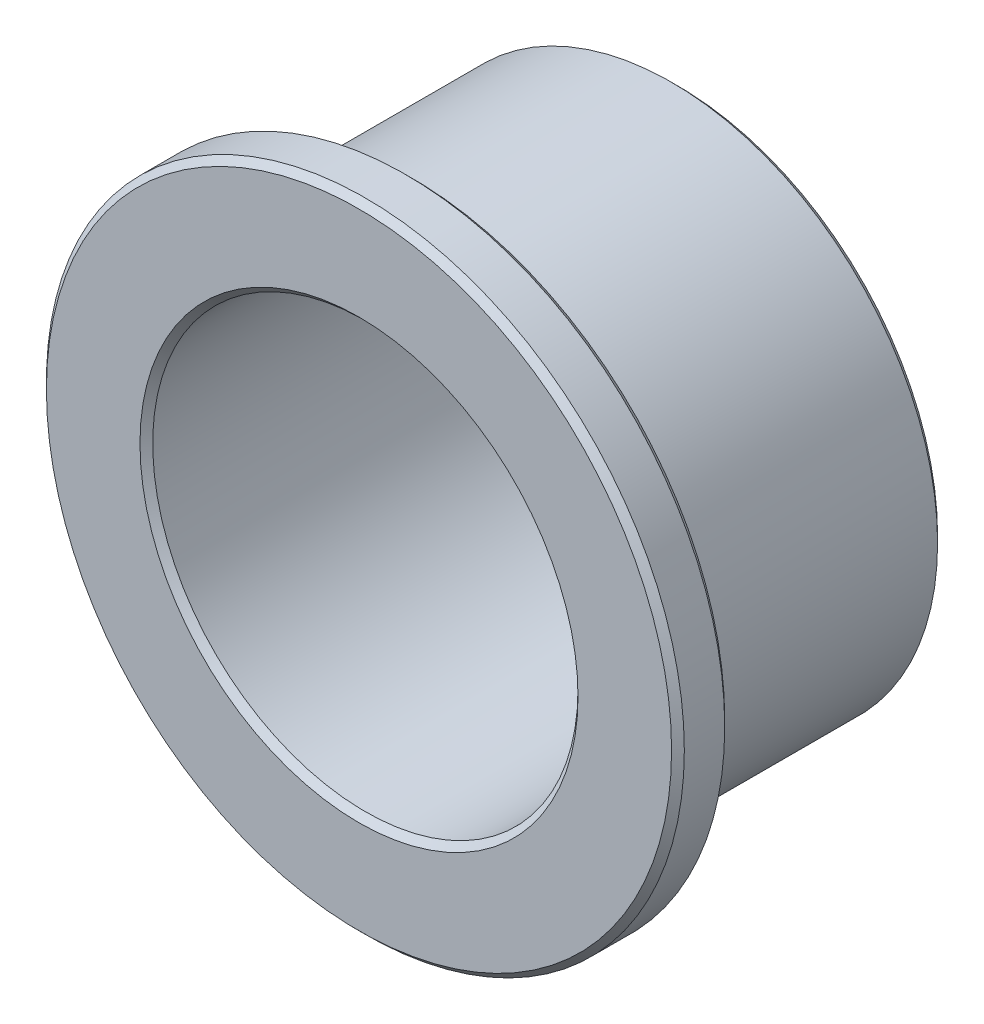
ISO-10303-21;
HEADER;
FILE_DESCRIPTION(('STEP AP214'),'2;1');
FILE_NAME('part.step','',(''),(''),'','','');
FILE_SCHEMA(('AUTOMOTIVE_DESIGN { 1 0 10303 214 1 1 1 1 }'));
ENDSEC;
DATA;
#1=APPLICATION_CONTEXT('core data for automotive mechanical design processes');
#2=APPLICATION_PROTOCOL_DEFINITION('international standard','automotive_design',2000,#1);
#3=PRODUCT_CONTEXT('',#1,'mechanical');
#4=PRODUCT('Part','Part','',(#3));
#5=PRODUCT_RELATED_PRODUCT_CATEGORY('part','',(#4));
#6=PRODUCT_DEFINITION_FORMATION('','',#4);
#7=PRODUCT_DEFINITION_CONTEXT('part definition',#1,'design');
#8=PRODUCT_DEFINITION('design','',#6,#7);
#9=PRODUCT_DEFINITION_SHAPE('','',#8);
#10=(LENGTH_UNIT() NAMED_UNIT(*) SI_UNIT(.MILLI.,.METRE.));
#11=(NAMED_UNIT(*) PLANE_ANGLE_UNIT() SI_UNIT($,.RADIAN.));
#12=(NAMED_UNIT(*) SI_UNIT($,.STERADIAN.) SOLID_ANGLE_UNIT());
#13=UNCERTAINTY_MEASURE_WITH_UNIT(LENGTH_MEASURE(1.E-05),#10,'distance_accuracy_value','');
#14=(GEOMETRIC_REPRESENTATION_CONTEXT(3) GLOBAL_UNCERTAINTY_ASSIGNED_CONTEXT((#13)) GLOBAL_UNIT_ASSIGNED_CONTEXT((#10,
#11,#12)) REPRESENTATION_CONTEXT('',''));
#15=CARTESIAN_POINT('',(0.,0.,0.));
#16=DIRECTION('',(0.,0.,1.));
#17=DIRECTION('',(1.,0.,0.));
#18=AXIS2_PLACEMENT_3D('',#15,#16,#17);
#19=CARTESIAN_POINT('',(0.,0.,6.34999999999999));
#20=DIRECTION('',(0.,0.,1.));
#21=DIRECTION('',(1.,0.,0.));
#22=AXIS2_PLACEMENT_3D('',#19,#20,#21);
#23=CYLINDRICAL_SURFACE('',#22,19.05);
#24=CARTESIAN_POINT('',(0.,0.,9.14399999999997));
#25=DIRECTION('',(0.,0.,1.));
#26=DIRECTION('',(1.,0.,0.));
#27=AXIS2_PLACEMENT_3D('',#24,#25,#26);
#28=CIRCLE('',#27,19.05);
#29=CARTESIAN_POINT('',(19.05,0.,9.14399999999997));
#30=VERTEX_POINT('',#29);
#31=EDGE_CURVE('E61',#30,#30,#28,.F.);
#32=ORIENTED_EDGE('',*,*,#31,.T.);
#33=EDGE_LOOP('',(#32));
#34=FACE_BOUND('',#33,.T.);
#35=CARTESIAN_POINT('',(0.,0.,6.73099999999999));
#36=DIRECTION('',(0.,0.,1.));
#37=DIRECTION('',(1.,0.,0.));
#38=AXIS2_PLACEMENT_3D('',#35,#36,#37);
#39=CIRCLE('',#38,19.05);
#40=CARTESIAN_POINT('',(19.05,0.,6.73099999999999));
#41=VERTEX_POINT('',#40);
#42=EDGE_CURVE('E64',#41,#41,#39,.T.);
#43=ORIENTED_EDGE('',*,*,#42,.T.);
#44=EDGE_LOOP('',(#43));
#45=FACE_BOUND('',#44,.T.);
#46=ADVANCED_FACE('F35',(#34,#45),#23,.T.);
#47=CARTESIAN_POINT('',(0.,0.,6.34999999999999));
#48=DIRECTION('',(0.,0.,1.));
#49=DIRECTION('',(1.,0.,0.));
#50=AXIS2_PLACEMENT_3D('',#47,#48,#49);
#51=PLANE('',#50);
#52=CARTESIAN_POINT('',(0.,0.,6.34999999999999));
#53=DIRECTION('',(0.,0.,1.));
#54=DIRECTION('',(1.,0.,0.));
#55=AXIS2_PLACEMENT_3D('',#52,#53,#54);
#56=CIRCLE('',#55,18.669);
#57=CARTESIAN_POINT('',(18.669,0.,6.34999999999999));
#58=VERTEX_POINT('',#57);
#59=EDGE_CURVE('E55',#58,#58,#56,.F.);
#60=ORIENTED_EDGE('',*,*,#59,.T.);
#61=EDGE_LOOP('',(#60));
#62=FACE_BOUND('',#61,.T.);
#63=CARTESIAN_POINT('',(0.,0.,6.34999999999999));
#64=DIRECTION('',(0.,0.,1.));
#65=DIRECTION('',(1.,0.,0.));
#66=AXIS2_PLACEMENT_3D('',#63,#64,#65);
#67=CIRCLE('',#66,16.2687);
#68=CARTESIAN_POINT('',(16.2687,0.,6.34999999999999));
#69=VERTEX_POINT('',#68);
#70=EDGE_CURVE('E58',#69,#69,#67,.T.);
#71=ORIENTED_EDGE('',*,*,#70,.T.);
#72=EDGE_LOOP('',(#71));
#73=FACE_BOUND('',#72,.T.);
#74=ADVANCED_FACE('F95',(#62,#73),#51,.F.);
#75=CARTESIAN_POINT('',(0.,0.,9.52499999999999));
#76=DIRECTION('',(0.,0.,1.));
#77=DIRECTION('',(1.,0.,0.));
#78=AXIS2_PLACEMENT_3D('',#75,#76,#77);
#79=PLANE('',#78);
#80=CARTESIAN_POINT('',(0.,0.,9.52499999999999));
#81=DIRECTION('',(0.,0.,1.));
#82=DIRECTION('',(1.,0.,0.));
#83=AXIS2_PLACEMENT_3D('',#80,#81,#82);
#84=CIRCLE('',#83,13.081);
#85=CARTESIAN_POINT('',(13.081,0.,9.52499999999999));
#86=VERTEX_POINT('',#85);
#87=EDGE_CURVE('E67',#86,#86,#84,.F.);
#88=ORIENTED_EDGE('',*,*,#87,.T.);
#89=EDGE_LOOP('',(#88));
#90=FACE_BOUND('',#89,.T.);
#91=CARTESIAN_POINT('',(0.,0.,9.52499999999999));
#92=DIRECTION('',(0.,0.,1.));
#93=DIRECTION('',(1.,0.,0.));
#94=AXIS2_PLACEMENT_3D('',#91,#92,#93);
#95=CIRCLE('',#94,18.669);
#96=CARTESIAN_POINT('',(18.669,0.,9.52499999999999));
#97=VERTEX_POINT('',#96);
#98=EDGE_CURVE('E70',#97,#97,#95,.T.);
#99=ORIENTED_EDGE('',*,*,#98,.T.);
#100=EDGE_LOOP('',(#99));
#101=FACE_BOUND('',#100,.T.);
#102=ADVANCED_FACE('F101',(#90,#101),#79,.T.);
#103=CARTESIAN_POINT('',(0.,0.,6.34999999999999));
#104=DIRECTION('',(0.,0.,1.));
#105=DIRECTION('',(1.,0.,0.));
#106=AXIS2_PLACEMENT_3D('',#103,#104,#105);
#107=CYLINDRICAL_SURFACE('',#106,12.7);
#108=CARTESIAN_POINT('',(0.,0.,9.14399999999998));
#109=DIRECTION('',(0.,0.,1.));
#110=DIRECTION('',(1.,0.,0.));
#111=AXIS2_PLACEMENT_3D('',#108,#109,#110);
#112=CIRCLE('',#111,12.7);
#113=CARTESIAN_POINT('',(12.7,0.,9.14399999999998));
#114=VERTEX_POINT('',#113);
#115=EDGE_CURVE('E73',#114,#114,#112,.T.);
#116=ORIENTED_EDGE('',*,*,#115,.T.);
#117=EDGE_LOOP('',(#116));
#118=FACE_BOUND('',#117,.T.);
#119=CARTESIAN_POINT('',(0.,0.,-9.144));
#120=DIRECTION('',(0.,0.,1.));
#121=DIRECTION('',(1.,0.,0.));
#122=AXIS2_PLACEMENT_3D('',#119,#120,#121);
#123=CIRCLE('',#122,12.7);
#124=CARTESIAN_POINT('',(12.7,0.,-9.144));
#125=VERTEX_POINT('',#124);
#126=EDGE_CURVE('E76',#125,#125,#123,.F.);
#127=ORIENTED_EDGE('',*,*,#126,.T.);
#128=EDGE_LOOP('',(#127));
#129=FACE_BOUND('',#128,.T.);
#130=ADVANCED_FACE('F80',(#118,#129),#107,.F.);
#131=CARTESIAN_POINT('',(0.,0.,-9.52500000000001));
#132=DIRECTION('',(0.,0.,1.));
#133=DIRECTION('',(1.,0.,0.));
#134=AXIS2_PLACEMENT_3D('',#131,#132,#133);
#135=CYLINDRICAL_SURFACE('',#134,15.8877);
#136=CARTESIAN_POINT('',(0.,0.,5.96899999999998));
#137=DIRECTION('',(0.,0.,1.));
#138=DIRECTION('',(1.,0.,0.));
#139=AXIS2_PLACEMENT_3D('',#136,#137,#138);
#140=CIRCLE('',#139,15.8877);
#141=CARTESIAN_POINT('',(15.8877,0.,5.96899999999998));
#142=VERTEX_POINT('',#141);
#143=EDGE_CURVE('E46',#142,#142,#140,.F.);
#144=ORIENTED_EDGE('',*,*,#143,.T.);
#145=EDGE_LOOP('',(#144));
#146=FACE_BOUND('',#145,.T.);
#147=CARTESIAN_POINT('',(0.,0.,-9.14400000000001));
#148=DIRECTION('',(0.,0.,1.));
#149=DIRECTION('',(1.,0.,0.));
#150=AXIS2_PLACEMENT_3D('',#147,#148,#149);
#151=CIRCLE('',#150,15.8877);
#152=CARTESIAN_POINT('',(15.8877,0.,-9.14400000000001));
#153=VERTEX_POINT('',#152);
#154=EDGE_CURVE('E50',#153,#153,#151,.T.);
#155=ORIENTED_EDGE('',*,*,#154,.T.);
#156=EDGE_LOOP('',(#155));
#157=FACE_BOUND('',#156,.T.);
#158=ADVANCED_FACE('F163',(#146,#157),#135,.T.);
#159=CARTESIAN_POINT('',(0.,0.,-9.52500000000001));
#160=DIRECTION('',(0.,0.,1.));
#161=DIRECTION('',(1.,0.,0.));
#162=AXIS2_PLACEMENT_3D('',#159,#160,#161);
#163=PLANE('',#162);
#164=CARTESIAN_POINT('',(0.,0.,-9.52500000000001));
#165=DIRECTION('',(0.,0.,1.));
#166=DIRECTION('',(1.,0.,0.));
#167=AXIS2_PLACEMENT_3D('',#164,#165,#166);
#168=CIRCLE('',#167,13.081);
#169=CARTESIAN_POINT('',(13.081,0.,-9.52500000000001));
#170=VERTEX_POINT('',#169);
#171=EDGE_CURVE('E10',#170,#170,#168,.T.);
#172=ORIENTED_EDGE('',*,*,#171,.T.);
#173=EDGE_LOOP('',(#172));
#174=FACE_BOUND('',#173,.T.);
#175=CARTESIAN_POINT('',(0.,0.,-9.52500000000001));
#176=DIRECTION('',(0.,0.,1.));
#177=DIRECTION('',(1.,0.,0.));
#178=AXIS2_PLACEMENT_3D('',#175,#176,#177);
#179=CIRCLE('',#178,15.5067);
#180=CARTESIAN_POINT('',(15.5067,0.,-9.52500000000001));
#181=VERTEX_POINT('',#180);
#182=EDGE_CURVE('E42',#181,#181,#179,.F.);
#183=ORIENTED_EDGE('',*,*,#182,.T.);
#184=EDGE_LOOP('',(#183));
#185=FACE_BOUND('',#184,.T.);
#186=ADVANCED_FACE('F111',(#174,#185),#163,.F.);
#187=CARTESIAN_POINT('',(0.,0.,9.14399999999998));
#188=DIRECTION('',(0.,0.,1.));
#189=DIRECTION('',(1.,0.,0.));
#190=AXIS2_PLACEMENT_3D('',#187,#188,#189);
#191=CONICAL_SURFACE('',#190,12.7,0.785398163397455);
#192=ORIENTED_EDGE('',*,*,#87,.F.);
#193=EDGE_LOOP('',(#192));
#194=FACE_BOUND('',#193,.T.);
#195=ORIENTED_EDGE('',*,*,#115,.F.);
#196=EDGE_LOOP('',(#195));
#197=FACE_BOUND('',#196,.T.);
#198=ADVANCED_FACE('F107',(#194,#197),#191,.F.);
#199=CARTESIAN_POINT('',(0.,0.,9.52499999999999));
#200=DIRECTION('',(0.,0.,-1.));
#201=DIRECTION('',(-1.,0.,0.));
#202=AXIS2_PLACEMENT_3D('',#199,#200,#201);
#203=CONICAL_SURFACE('',#202,18.669,0.785398163397444);
#204=ORIENTED_EDGE('',*,*,#31,.F.);
#205=EDGE_LOOP('',(#204));
#206=FACE_BOUND('',#205,.T.);
#207=ORIENTED_EDGE('',*,*,#98,.F.);
#208=EDGE_LOOP('',(#207));
#209=FACE_BOUND('',#208,.T.);
#210=ADVANCED_FACE('F110',(#206,#209),#203,.T.);
#211=CARTESIAN_POINT('',(0.,0.,6.73099999999999));
#212=DIRECTION('',(0.,0.,1.));
#213=DIRECTION('',(1.,0.,0.));
#214=AXIS2_PLACEMENT_3D('',#211,#212,#213);
#215=CONICAL_SURFACE('',#214,19.05,0.785398163397448);
#216=ORIENTED_EDGE('',*,*,#59,.F.);
#217=EDGE_LOOP('',(#216));
#218=FACE_BOUND('',#217,.T.);
#219=ORIENTED_EDGE('',*,*,#42,.F.);
#220=EDGE_LOOP('',(#219));
#221=FACE_BOUND('',#220,.T.);
#222=ADVANCED_FACE('F91',(#218,#221),#215,.T.);
#223=CARTESIAN_POINT('',(0.,0.,6.34999999999999));
#224=DIRECTION('',(0.,0.,1.));
#225=DIRECTION('',(1.,0.,0.));
#226=AXIS2_PLACEMENT_3D('',#223,#224,#225);
#227=CONICAL_SURFACE('',#226,16.2687,0.785398163397453);
#228=ORIENTED_EDGE('',*,*,#143,.F.);
#229=EDGE_LOOP('',(#228));
#230=FACE_BOUND('',#229,.T.);
#231=ORIENTED_EDGE('',*,*,#70,.F.);
#232=EDGE_LOOP('',(#231));
#233=FACE_BOUND('',#232,.T.);
#234=ADVANCED_FACE('F85',(#230,#233),#227,.T.);
#235=CARTESIAN_POINT('',(0.,0.,-9.52500000000001));
#236=DIRECTION('',(0.,0.,-1.));
#237=DIRECTION('',(-1.,0.,0.));
#238=AXIS2_PLACEMENT_3D('',#235,#236,#237);
#239=CONICAL_SURFACE('',#238,13.081,0.785398163397446);
#240=ORIENTED_EDGE('',*,*,#126,.F.);
#241=EDGE_LOOP('',(#240));
#242=FACE_BOUND('',#241,.T.);
#243=ORIENTED_EDGE('',*,*,#171,.F.);
#244=EDGE_LOOP('',(#243));
#245=FACE_BOUND('',#244,.T.);
#246=ADVANCED_FACE('F82',(#242,#245),#239,.F.);
#247=CARTESIAN_POINT('',(0.,0.,-9.14400000000001));
#248=DIRECTION('',(0.,0.,1.));
#249=DIRECTION('',(1.,0.,0.));
#250=AXIS2_PLACEMENT_3D('',#247,#248,#249);
#251=CONICAL_SURFACE('',#250,15.8877,0.785398163397453);
#252=ORIENTED_EDGE('',*,*,#182,.F.);
#253=EDGE_LOOP('',(#252));
#254=FACE_BOUND('',#253,.T.);
#255=ORIENTED_EDGE('',*,*,#154,.F.);
#256=EDGE_LOOP('',(#255));
#257=FACE_BOUND('',#256,.T.);
#258=ADVANCED_FACE('F37',(#254,#257),#251,.T.);
#259=CLOSED_SHELL('',(#46,#74,#102,#130,#158,#186,#198,#210,#222,#234,#246,#258));
#260=MANIFOLD_SOLID_BREP('B2',#259);
#261=ADVANCED_BREP_SHAPE_REPRESENTATION('',(#18,#260),#14);
#262=SHAPE_DEFINITION_REPRESENTATION(#9,#261);
ENDSEC;
END-ISO-10303-21;
